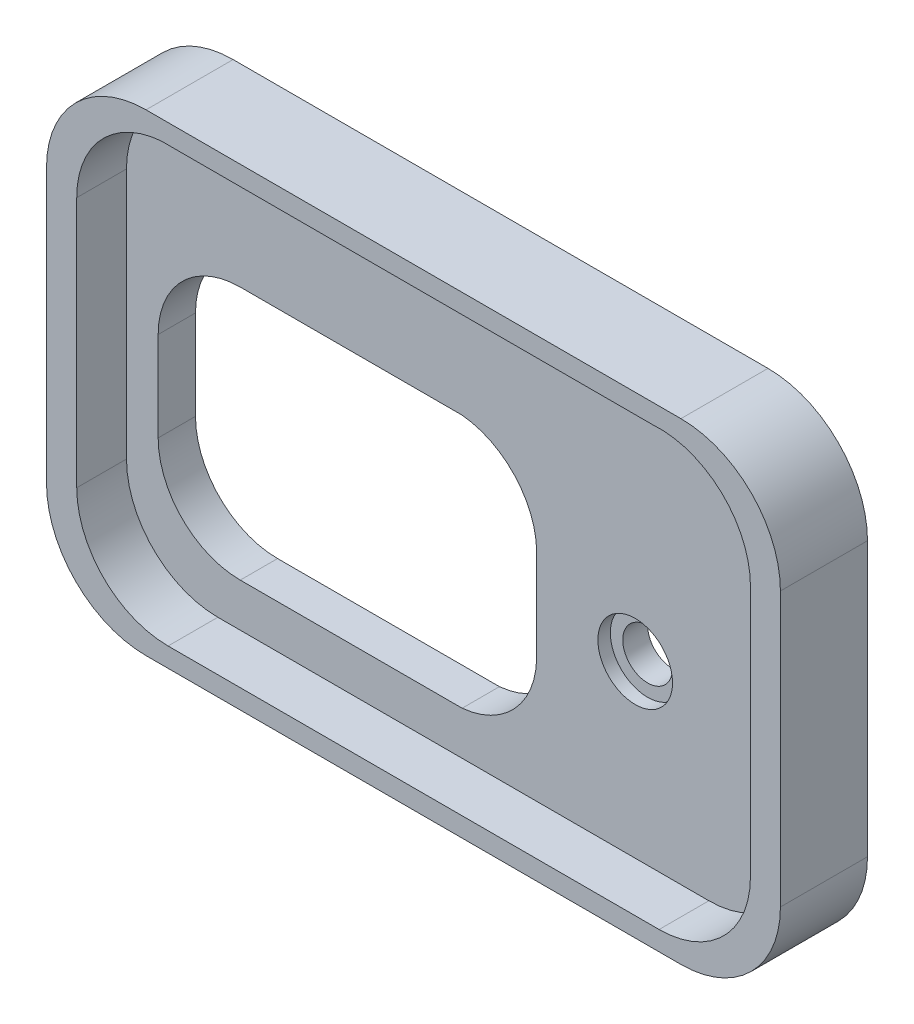
ISO-10303-21;
HEADER;
FILE_DESCRIPTION(('STEP AP214'),'2;1');
FILE_NAME('part.step','',(''),(''),'','','');
FILE_SCHEMA(('AUTOMOTIVE_DESIGN { 1 0 10303 214 1 1 1 1 }'));
ENDSEC;
DATA;
#1=APPLICATION_CONTEXT('core data for automotive mechanical design processes');
#2=APPLICATION_PROTOCOL_DEFINITION('international standard','automotive_design',2000,#1);
#3=PRODUCT_CONTEXT('',#1,'mechanical');
#4=PRODUCT('Part','Part','',(#3));
#5=PRODUCT_RELATED_PRODUCT_CATEGORY('part','',(#4));
#6=PRODUCT_DEFINITION_FORMATION('','',#4);
#7=PRODUCT_DEFINITION_CONTEXT('part definition',#1,'design');
#8=PRODUCT_DEFINITION('design','',#6,#7);
#9=PRODUCT_DEFINITION_SHAPE('','',#8);
#10=(LENGTH_UNIT() NAMED_UNIT(*) SI_UNIT(.MILLI.,.METRE.));
#11=(NAMED_UNIT(*) PLANE_ANGLE_UNIT() SI_UNIT($,.RADIAN.));
#12=(NAMED_UNIT(*) SI_UNIT($,.STERADIAN.) SOLID_ANGLE_UNIT());
#13=UNCERTAINTY_MEASURE_WITH_UNIT(LENGTH_MEASURE(1.E-05),#10,'distance_accuracy_value','');
#14=(GEOMETRIC_REPRESENTATION_CONTEXT(3) GLOBAL_UNCERTAINTY_ASSIGNED_CONTEXT((#13)) GLOBAL_UNIT_ASSIGNED_CONTEXT((#10,
#11,#12)) REPRESENTATION_CONTEXT('',''));
#15=CARTESIAN_POINT('',(0.,0.,0.));
#16=DIRECTION('',(0.,0.,1.));
#17=DIRECTION('',(1.,0.,0.));
#18=AXIS2_PLACEMENT_3D('',#15,#16,#17);
#19=CARTESIAN_POINT('',(27.511650568665,9.68988988046832,-0.635000000000001));
#20=DIRECTION('',(0.,0.,1.));
#21=DIRECTION('',(1.,0.,0.));
#22=AXIS2_PLACEMENT_3D('',#19,#20,#21);
#23=CYLINDRICAL_SURFACE('',#22,1.27);
#24=CARTESIAN_POINT('',(27.511650568665,9.68988988046832,0.));
#25=DIRECTION('',(0.,0.,-1.));
#26=DIRECTION('',(-1.,0.,0.));
#27=AXIS2_PLACEMENT_3D('',#24,#25,#26);
#28=CIRCLE('',#27,1.27);
#29=CARTESIAN_POINT('',(26.241650568665,9.68988988046832,0.));
#30=VERTEX_POINT('',#29);
#31=EDGE_CURVE('E261',#30,#30,#28,.T.);
#32=ORIENTED_EDGE('',*,*,#31,.T.);
#33=EDGE_LOOP('',(#32));
#34=FACE_BOUND('',#33,.T.);
#35=CARTESIAN_POINT('',(27.511650568665,9.68988988046832,1.27));
#36=DIRECTION('',(0.,0.,1.));
#37=DIRECTION('',(1.,0.,0.));
#38=AXIS2_PLACEMENT_3D('',#35,#36,#37);
#39=CIRCLE('',#38,1.27);
#40=CARTESIAN_POINT('',(28.781650568665,9.68988988046832,1.27));
#41=VERTEX_POINT('',#40);
#42=EDGE_CURVE('E254',#41,#41,#39,.T.);
#43=ORIENTED_EDGE('',*,*,#42,.T.);
#44=EDGE_LOOP('',(#43));
#45=FACE_BOUND('',#44,.T.);
#46=ADVANCED_FACE('F38',(#34,#45),#23,.F.);
#47=CARTESIAN_POINT('',(0.,0.,4.445));
#48=DIRECTION('',(1.,0.,0.));
#49=DIRECTION('',(0.,0.,-1.));
#50=AXIS2_PLACEMENT_3D('',#47,#48,#49);
#51=PLANE('',#50);
#52=DIRECTION('',(0.,-1.,0.));
#53=VECTOR('',#52,1.);
#54=CARTESIAN_POINT('',(0.,0.,0.));
#55=LINE('',#54,#53);
#56=CARTESIAN_POINT('',(0.,19.05,0.));
#57=VERTEX_POINT('',#56);
#58=CARTESIAN_POINT('',(0.,5.08,0.));
#59=VERTEX_POINT('',#58);
#60=EDGE_CURVE('E291',#57,#59,#55,.T.);
#61=ORIENTED_EDGE('',*,*,#60,.T.);
#62=DIRECTION('',(0.,0.,-1.));
#63=VECTOR('',#62,1.);
#64=CARTESIAN_POINT('',(0.,5.08,4.445));
#65=LINE('',#64,#63);
#66=CARTESIAN_POINT('',(0.,5.08,4.445));
#67=VERTEX_POINT('',#66);
#68=EDGE_CURVE('E362',#59,#67,#65,.F.);
#69=ORIENTED_EDGE('',*,*,#68,.T.);
#70=DIRECTION('',(0.,-1.,0.));
#71=VECTOR('',#70,1.);
#72=CARTESIAN_POINT('',(0.,0.,4.445));
#73=LINE('',#72,#71);
#74=CARTESIAN_POINT('',(0.,19.05,4.445));
#75=VERTEX_POINT('',#74);
#76=EDGE_CURVE('E305',#75,#67,#73,.T.);
#77=ORIENTED_EDGE('',*,*,#76,.F.);
#78=DIRECTION('',(0.,0.,-1.));
#79=VECTOR('',#78,1.);
#80=CARTESIAN_POINT('',(0.,19.05,4.445));
#81=LINE('',#80,#79);
#82=EDGE_CURVE('E359',#75,#57,#81,.T.);
#83=ORIENTED_EDGE('',*,*,#82,.T.);
#84=EDGE_LOOP('',(#61,#69,#77,#83));
#85=FACE_BOUND('',#84,.T.);
#86=ADVANCED_FACE('F428',(#85),#51,.F.);
#87=CARTESIAN_POINT('',(0.,0.,4.445));
#88=DIRECTION('',(0.,1.,0.));
#89=DIRECTION('',(0.,0.,1.));
#90=AXIS2_PLACEMENT_3D('',#87,#88,#89);
#91=PLANE('',#90);
#92=DIRECTION('',(1.,0.,0.));
#93=VECTOR('',#92,1.);
#94=CARTESIAN_POINT('',(0.,0.,0.));
#95=LINE('',#94,#93);
#96=CARTESIAN_POINT('',(5.08,0.,0.));
#97=VERTEX_POINT('',#96);
#98=CARTESIAN_POINT('',(32.385,0.,0.));
#99=VERTEX_POINT('',#98);
#100=EDGE_CURVE('E321',#97,#99,#95,.T.);
#101=ORIENTED_EDGE('',*,*,#100,.T.);
#102=DIRECTION('',(0.,0.,-1.));
#103=VECTOR('',#102,1.);
#104=CARTESIAN_POINT('',(32.385,0.,4.445));
#105=LINE('',#104,#103);
#106=CARTESIAN_POINT('',(32.385,0.,4.445));
#107=VERTEX_POINT('',#106);
#108=EDGE_CURVE('E357',#99,#107,#105,.F.);
#109=ORIENTED_EDGE('',*,*,#108,.T.);
#110=DIRECTION('',(1.,0.,0.));
#111=VECTOR('',#110,1.);
#112=CARTESIAN_POINT('',(0.,0.,4.445));
#113=LINE('',#112,#111);
#114=CARTESIAN_POINT('',(5.08,0.,4.445));
#115=VERTEX_POINT('',#114);
#116=EDGE_CURVE('E308',#115,#107,#113,.T.);
#117=ORIENTED_EDGE('',*,*,#116,.F.);
#118=DIRECTION('',(0.,0.,-1.));
#119=VECTOR('',#118,1.);
#120=CARTESIAN_POINT('',(5.08,0.,4.445));
#121=LINE('',#120,#119);
#122=EDGE_CURVE('E354',#115,#97,#121,.T.);
#123=ORIENTED_EDGE('',*,*,#122,.T.);
#124=EDGE_LOOP('',(#101,#109,#117,#123));
#125=FACE_BOUND('',#124,.T.);
#126=ADVANCED_FACE('F434',(#125),#91,.F.);
#127=CARTESIAN_POINT('',(37.465,0.,4.445));
#128=DIRECTION('',(-1.,0.,0.));
#129=DIRECTION('',(0.,0.,1.));
#130=AXIS2_PLACEMENT_3D('',#127,#128,#129);
#131=PLANE('',#130);
#132=DIRECTION('',(0.,1.,0.));
#133=VECTOR('',#132,1.);
#134=CARTESIAN_POINT('',(37.465,0.,0.));
#135=LINE('',#134,#133);
#136=CARTESIAN_POINT('',(37.465,5.08,0.));
#137=VERTEX_POINT('',#136);
#138=CARTESIAN_POINT('',(37.465,19.05,0.));
#139=VERTEX_POINT('',#138);
#140=EDGE_CURVE('E324',#137,#139,#135,.T.);
#141=ORIENTED_EDGE('',*,*,#140,.T.);
#142=DIRECTION('',(0.,0.,-1.));
#143=VECTOR('',#142,1.);
#144=CARTESIAN_POINT('',(37.465,19.05,4.445));
#145=LINE('',#144,#143);
#146=CARTESIAN_POINT('',(37.465,19.05,4.445));
#147=VERTEX_POINT('',#146);
#148=EDGE_CURVE('E344',#139,#147,#145,.F.);
#149=ORIENTED_EDGE('',*,*,#148,.T.);
#150=DIRECTION('',(0.,1.,0.));
#151=VECTOR('',#150,1.);
#152=CARTESIAN_POINT('',(37.465,0.,4.445));
#153=LINE('',#152,#151);
#154=CARTESIAN_POINT('',(37.465,5.08,4.445));
#155=VERTEX_POINT('',#154);
#156=EDGE_CURVE('E312',#155,#147,#153,.T.);
#157=ORIENTED_EDGE('',*,*,#156,.F.);
#158=DIRECTION('',(0.,0.,-1.));
#159=VECTOR('',#158,1.);
#160=CARTESIAN_POINT('',(37.465,5.08,4.445));
#161=LINE('',#160,#159);
#162=EDGE_CURVE('E341',#155,#137,#161,.T.);
#163=ORIENTED_EDGE('',*,*,#162,.T.);
#164=EDGE_LOOP('',(#141,#149,#157,#163));
#165=FACE_BOUND('',#164,.T.);
#166=ADVANCED_FACE('F700',(#165),#131,.F.);
#167=CARTESIAN_POINT('',(0.,24.13,4.445));
#168=DIRECTION('',(0.,-1.,0.));
#169=DIRECTION('',(0.,0.,-1.));
#170=AXIS2_PLACEMENT_3D('',#167,#168,#169);
#171=PLANE('',#170);
#172=DIRECTION('',(-1.,0.,0.));
#173=VECTOR('',#172,1.);
#174=CARTESIAN_POINT('',(0.,24.13,4.445));
#175=LINE('',#174,#173);
#176=CARTESIAN_POINT('',(32.385,24.13,4.445));
#177=VERTEX_POINT('',#176);
#178=CARTESIAN_POINT('',(5.08,24.13,4.445));
#179=VERTEX_POINT('',#178);
#180=EDGE_CURVE('E315',#177,#179,#175,.T.);
#181=ORIENTED_EDGE('',*,*,#180,.F.);
#182=DIRECTION('',(0.,0.,-1.));
#183=VECTOR('',#182,1.);
#184=CARTESIAN_POINT('',(32.385,24.13,4.445));
#185=LINE('',#184,#183);
#186=CARTESIAN_POINT('',(32.385,24.13,0.));
#187=VERTEX_POINT('',#186);
#188=EDGE_CURVE('E330',#177,#187,#185,.T.);
#189=ORIENTED_EDGE('',*,*,#188,.T.);
#190=DIRECTION('',(-1.,0.,0.));
#191=VECTOR('',#190,1.);
#192=CARTESIAN_POINT('',(0.,24.13,0.));
#193=LINE('',#192,#191);
#194=CARTESIAN_POINT('',(5.08,24.13,0.));
#195=VERTEX_POINT('',#194);
#196=EDGE_CURVE('E309',#187,#195,#193,.T.);
#197=ORIENTED_EDGE('',*,*,#196,.T.);
#198=DIRECTION('',(0.,0.,-1.));
#199=VECTOR('',#198,1.);
#200=CARTESIAN_POINT('',(5.08,24.13,4.445));
#201=LINE('',#200,#199);
#202=EDGE_CURVE('E318',#195,#179,#201,.F.);
#203=ORIENTED_EDGE('',*,*,#202,.T.);
#204=EDGE_LOOP('',(#181,#189,#197,#203));
#205=FACE_BOUND('',#204,.T.);
#206=ADVANCED_FACE('F509',(#205),#171,.F.);
#207=CARTESIAN_POINT('',(0.,0.,4.445));
#208=DIRECTION('',(0.,0.,-1.));
#209=DIRECTION('',(-1.,0.,0.));
#210=AXIS2_PLACEMENT_3D('',#207,#208,#209);
#211=PLANE('',#210);
#212=CARTESIAN_POINT('',(31.2722595725624,5.65277000000001,4.445));
#213=DIRECTION('',(0.,0.,1.));
#214=DIRECTION('',(1.,0.,0.));
#215=AXIS2_PLACEMENT_3D('',#212,#213,#214);
#216=CIRCLE('',#215,4.66344);
#217=CARTESIAN_POINT('',(31.2722595725624,0.989330000000008,4.445));
#218=VERTEX_POINT('',#217);
#219=CARTESIAN_POINT('',(35.9356995725624,5.65277000000001,4.445));
#220=VERTEX_POINT('',#219);
#221=EDGE_CURVE('E223',#218,#220,#216,.T.);
#222=ORIENTED_EDGE('',*,*,#221,.F.);
#223=DIRECTION('',(1.,0.,0.));
#224=VECTOR('',#223,1.);
#225=CARTESIAN_POINT('',(6.20626957256244,0.989330000000004,4.445));
#226=LINE('',#225,#224);
#227=CARTESIAN_POINT('',(6.20626957256244,0.989330000000004,4.445));
#228=VERTEX_POINT('',#227);
#229=EDGE_CURVE('E205',#228,#218,#226,.T.);
#230=ORIENTED_EDGE('',*,*,#229,.F.);
#231=CARTESIAN_POINT('',(6.20626957256244,5.65277000000001,4.445));
#232=DIRECTION('',(0.,0.,1.));
#233=DIRECTION('',(1.,0.,0.));
#234=AXIS2_PLACEMENT_3D('',#231,#232,#233);
#235=CIRCLE('',#234,4.66344);
#236=CARTESIAN_POINT('',(1.54282957256243,5.65277000000001,4.445));
#237=VERTEX_POINT('',#236);
#238=EDGE_CURVE('E214',#237,#228,#235,.T.);
#239=ORIENTED_EDGE('',*,*,#238,.F.);
#240=DIRECTION('',(0.,-1.,0.));
#241=VECTOR('',#240,1.);
#242=CARTESIAN_POINT('',(1.54282957256243,18.47723,4.445));
#243=LINE('',#242,#241);
#244=CARTESIAN_POINT('',(1.54282957256243,18.47723,4.445));
#245=VERTEX_POINT('',#244);
#246=EDGE_CURVE('E53',#245,#237,#243,.T.);
#247=ORIENTED_EDGE('',*,*,#246,.F.);
#248=CARTESIAN_POINT('',(6.20625206859993,18.4900072082819,4.445));
#249=DIRECTION('',(0.,0.,1.));
#250=DIRECTION('',(1.,0.,0.));
#251=AXIS2_PLACEMENT_3D('',#248,#249,#250);
#252=CIRCLE('',#251,4.66344);
#253=CARTESIAN_POINT('',(5.86127637187822,23.14067,4.445));
#254=VERTEX_POINT('',#253);
#255=EDGE_CURVE('E237',#254,#245,#252,.T.);
#256=ORIENTED_EDGE('',*,*,#255,.F.);
#257=DIRECTION('',(-1.,0.,0.));
#258=VECTOR('',#257,1.);
#259=CARTESIAN_POINT('',(30.9272663718782,23.14067,4.445));
#260=LINE('',#259,#258);
#261=CARTESIAN_POINT('',(30.9272663718782,23.14067,4.445));
#262=VERTEX_POINT('',#261);
#263=EDGE_CURVE('E234',#262,#254,#260,.T.);
#264=ORIENTED_EDGE('',*,*,#263,.F.);
#265=CARTESIAN_POINT('',(31.2722770836424,18.4900098057515,4.445));
#266=DIRECTION('',(0.,0.,1.));
#267=DIRECTION('',(1.,0.,0.));
#268=AXIS2_PLACEMENT_3D('',#265,#266,#267);
#269=CIRCLE('',#268,4.66344000000001);
#270=CARTESIAN_POINT('',(35.9356995725624,18.47723,4.445));
#271=VERTEX_POINT('',#270);
#272=EDGE_CURVE('E231',#271,#262,#269,.T.);
#273=ORIENTED_EDGE('',*,*,#272,.F.);
#274=DIRECTION('',(0.,1.,0.));
#275=VECTOR('',#274,1.);
#276=CARTESIAN_POINT('',(35.9356995725624,5.65277000000001,4.445));
#277=LINE('',#276,#275);
#278=EDGE_CURVE('E225',#220,#271,#277,.T.);
#279=ORIENTED_EDGE('',*,*,#278,.F.);
#280=EDGE_LOOP('',(#222,#230,#239,#247,#256,#264,#273,#279));
#281=FACE_BOUND('',#280,.T.);
#282=ORIENTED_EDGE('',*,*,#156,.T.);
#283=CARTESIAN_POINT('',(32.385,19.05,4.445));
#284=DIRECTION('',(0.,0.,-1.));
#285=DIRECTION('',(-1.,0.,0.));
#286=AXIS2_PLACEMENT_3D('',#283,#284,#285);
#287=CIRCLE('',#286,5.08);
#288=EDGE_CURVE('E352',#147,#177,#287,.F.);
#289=ORIENTED_EDGE('',*,*,#288,.T.);
#290=ORIENTED_EDGE('',*,*,#180,.T.);
#291=CARTESIAN_POINT('',(5.08,19.05,4.445));
#292=DIRECTION('',(0.,0.,-1.));
#293=DIRECTION('',(-1.,0.,0.));
#294=AXIS2_PLACEMENT_3D('',#291,#292,#293);
#295=CIRCLE('',#294,5.08);
#296=EDGE_CURVE('E346',#179,#75,#295,.F.);
#297=ORIENTED_EDGE('',*,*,#296,.T.);
#298=ORIENTED_EDGE('',*,*,#76,.T.);
#299=CARTESIAN_POINT('',(5.08,5.08,4.445));
#300=DIRECTION('',(0.,0.,-1.));
#301=DIRECTION('',(-1.,0.,0.));
#302=AXIS2_PLACEMENT_3D('',#299,#300,#301);
#303=CIRCLE('',#302,5.08);
#304=EDGE_CURVE('E348',#67,#115,#303,.F.);
#305=ORIENTED_EDGE('',*,*,#304,.T.);
#306=ORIENTED_EDGE('',*,*,#116,.T.);
#307=CARTESIAN_POINT('',(32.385,5.08,4.445));
#308=DIRECTION('',(0.,0.,-1.));
#309=DIRECTION('',(-1.,0.,0.));
#310=AXIS2_PLACEMENT_3D('',#307,#308,#309);
#311=CIRCLE('',#310,5.08);
#312=EDGE_CURVE('E350',#107,#155,#311,.F.);
#313=ORIENTED_EDGE('',*,*,#312,.T.);
#314=EDGE_LOOP('',(#282,#289,#290,#297,#298,#305,#306,#313));
#315=FACE_BOUND('',#314,.T.);
#316=ADVANCED_FACE('F219',(#281,#315),#211,.F.);
#317=CARTESIAN_POINT('',(0.,0.,0.));
#318=DIRECTION('',(0.,0.,-1.));
#319=DIRECTION('',(-1.,0.,0.));
#320=AXIS2_PLACEMENT_3D('',#317,#318,#319);
#321=PLANE('',#320);
#322=ORIENTED_EDGE('',*,*,#31,.F.);
#323=EDGE_LOOP('',(#322));
#324=FACE_BOUND('',#323,.T.);
#325=CARTESIAN_POINT('',(7.35086965438628,11.9679737585275,0.));
#326=DIRECTION('',(0.,0.,-1.));
#327=DIRECTION('',(-1.,0.,0.));
#328=AXIS2_PLACEMENT_3D('',#325,#326,#327);
#329=CIRCLE('',#328,4.19100000000001);
#330=CARTESIAN_POINT('',(3.15986965438626,11.9679737585274,0.));
#331=VERTEX_POINT('',#330);
#332=CARTESIAN_POINT('',(7.35086965438628,16.1589737585275,0.));
#333=VERTEX_POINT('',#332);
#334=EDGE_CURVE('E11',#331,#333,#329,.T.);
#335=ORIENTED_EDGE('',*,*,#334,.F.);
#336=DIRECTION('',(0.,1.,0.));
#337=VECTOR('',#336,1.);
#338=CARTESIAN_POINT('',(3.15986965438626,0.,0.));
#339=LINE('',#338,#337);
#340=CARTESIAN_POINT('',(3.15986965438626,7.39597375852747,0.));
#341=VERTEX_POINT('',#340);
#342=EDGE_CURVE('E364',#341,#331,#339,.T.);
#343=ORIENTED_EDGE('',*,*,#342,.F.);
#344=CARTESIAN_POINT('',(7.35086965438626,7.39597375852747,0.));
#345=DIRECTION('',(0.,0.,-1.));
#346=DIRECTION('',(-1.,0.,0.));
#347=AXIS2_PLACEMENT_3D('',#344,#345,#346);
#348=CIRCLE('',#347,4.191);
#349=CARTESIAN_POINT('',(7.35086965438665,3.20497375852747,0.));
#350=VERTEX_POINT('',#349);
#351=EDGE_CURVE('E366',#350,#341,#348,.T.);
#352=ORIENTED_EDGE('',*,*,#351,.F.);
#353=DIRECTION('',(-1.,0.,0.));
#354=VECTOR('',#353,1.);
#355=CARTESIAN_POINT('',(0.,3.20497375852747,0.));
#356=LINE('',#355,#354);
#357=CARTESIAN_POINT('',(18.6779953133419,3.20497375852747,0.));
#358=VERTEX_POINT('',#357);
#359=EDGE_CURVE('E369',#358,#350,#356,.T.);
#360=ORIENTED_EDGE('',*,*,#359,.F.);
#361=CARTESIAN_POINT('',(18.2728696543863,7.39597375852747,0.));
#362=DIRECTION('',(0.,0.,-1.));
#363=DIRECTION('',(-1.,0.,0.));
#364=AXIS2_PLACEMENT_3D('',#361,#362,#363);
#365=CIRCLE('',#364,4.21053533408095);
#366=CARTESIAN_POINT('',(22.4638696543863,7.80109941748326,0.));
#367=VERTEX_POINT('',#366);
#368=EDGE_CURVE('E371',#367,#358,#365,.T.);
#369=ORIENTED_EDGE('',*,*,#368,.F.);
#370=DIRECTION('',(0.,1.,0.));
#371=VECTOR('',#370,1.);
#372=CARTESIAN_POINT('',(22.4638696543863,0.,0.));
#373=LINE('',#372,#371);
#374=CARTESIAN_POINT('',(22.4638696543863,11.5628480995716,0.));
#375=VERTEX_POINT('',#374);
#376=EDGE_CURVE('E373',#367,#375,#373,.T.);
#377=ORIENTED_EDGE('',*,*,#376,.T.);
#378=CARTESIAN_POINT('',(18.2728696543863,11.9679737585275,0.));
#379=DIRECTION('',(0.,0.,-1.));
#380=DIRECTION('',(-1.,0.,0.));
#381=AXIS2_PLACEMENT_3D('',#378,#379,#380);
#382=CIRCLE('',#381,4.21053533408098);
#383=CARTESIAN_POINT('',(18.6779953133422,16.1589737585275,0.));
#384=VERTEX_POINT('',#383);
#385=EDGE_CURVE('E376',#375,#384,#382,.F.);
#386=ORIENTED_EDGE('',*,*,#385,.T.);
#387=DIRECTION('',(-1.,0.,0.));
#388=VECTOR('',#387,1.);
#389=CARTESIAN_POINT('',(0.,16.1589737585275,0.));
#390=LINE('',#389,#388);
#391=EDGE_CURVE('E46',#384,#333,#390,.T.);
#392=ORIENTED_EDGE('',*,*,#391,.T.);
#393=EDGE_LOOP('',(#335,#343,#352,#360,#369,#377,#386,#392));
#394=FACE_BOUND('',#393,.T.);
#395=ORIENTED_EDGE('',*,*,#196,.F.);
#396=CARTESIAN_POINT('',(32.385,19.05,0.));
#397=DIRECTION('',(0.,0.,-1.));
#398=DIRECTION('',(-1.,0.,0.));
#399=AXIS2_PLACEMENT_3D('',#396,#397,#398);
#400=CIRCLE('',#399,5.08);
#401=EDGE_CURVE('E339',#187,#139,#400,.T.);
#402=ORIENTED_EDGE('',*,*,#401,.T.);
#403=ORIENTED_EDGE('',*,*,#140,.F.);
#404=CARTESIAN_POINT('',(32.385,5.08,0.));
#405=DIRECTION('',(0.,0.,-1.));
#406=DIRECTION('',(-1.,0.,0.));
#407=AXIS2_PLACEMENT_3D('',#404,#405,#406);
#408=CIRCLE('',#407,5.08);
#409=EDGE_CURVE('E337',#137,#99,#408,.T.);
#410=ORIENTED_EDGE('',*,*,#409,.T.);
#411=ORIENTED_EDGE('',*,*,#100,.F.);
#412=CARTESIAN_POINT('',(5.08,5.08,0.));
#413=DIRECTION('',(0.,0.,-1.));
#414=DIRECTION('',(-1.,0.,0.));
#415=AXIS2_PLACEMENT_3D('',#412,#413,#414);
#416=CIRCLE('',#415,5.08);
#417=EDGE_CURVE('E335',#97,#59,#416,.T.);
#418=ORIENTED_EDGE('',*,*,#417,.T.);
#419=ORIENTED_EDGE('',*,*,#60,.F.);
#420=CARTESIAN_POINT('',(5.08,19.05,0.));
#421=DIRECTION('',(0.,0.,-1.));
#422=DIRECTION('',(-1.,0.,0.));
#423=AXIS2_PLACEMENT_3D('',#420,#421,#422);
#424=CIRCLE('',#423,5.08);
#425=EDGE_CURVE('E333',#57,#195,#424,.T.);
#426=ORIENTED_EDGE('',*,*,#425,.T.);
#427=EDGE_LOOP('',(#395,#402,#403,#410,#411,#418,#419,#426));
#428=FACE_BOUND('',#427,.T.);
#429=ADVANCED_FACE('F381',(#324,#394,#428),#321,.T.);
#430=CARTESIAN_POINT('',(0.,0.,1.905));
#431=DIRECTION('',(0.,0.,1.));
#432=DIRECTION('',(1.,0.,0.));
#433=AXIS2_PLACEMENT_3D('',#430,#431,#432);
#434=PLANE('',#433);
#435=CARTESIAN_POINT('',(27.511650568665,9.68988988046832,1.905));
#436=DIRECTION('',(0.,0.,1.));
#437=DIRECTION('',(1.,0.,0.));
#438=AXIS2_PLACEMENT_3D('',#435,#436,#437);
#439=CIRCLE('',#438,1.905);
#440=CARTESIAN_POINT('',(29.416650568665,9.68988988046832,1.905));
#441=VERTEX_POINT('',#440);
#442=EDGE_CURVE('E257',#441,#441,#439,.T.);
#443=ORIENTED_EDGE('',*,*,#442,.F.);
#444=EDGE_LOOP('',(#443));
#445=FACE_BOUND('',#444,.T.);
#446=CARTESIAN_POINT('',(7.35086965438628,11.9679737585275,1.905));
#447=DIRECTION('',(0.,0.,1.));
#448=DIRECTION('',(1.,0.,0.));
#449=AXIS2_PLACEMENT_3D('',#446,#447,#448);
#450=CIRCLE('',#449,4.19100000000001);
#451=CARTESIAN_POINT('',(7.35086965438628,16.1589737585275,1.905));
#452=VERTEX_POINT('',#451);
#453=CARTESIAN_POINT('',(3.15986965438626,11.9679737585274,1.905));
#454=VERTEX_POINT('',#453);
#455=EDGE_CURVE('E266',#452,#454,#450,.T.);
#456=ORIENTED_EDGE('',*,*,#455,.F.);
#457=DIRECTION('',(1.,0.,0.));
#458=VECTOR('',#457,1.);
#459=CARTESIAN_POINT('',(7.35086965438628,16.1589737585275,1.905));
#460=LINE('',#459,#458);
#461=CARTESIAN_POINT('',(18.6779953133422,16.1589737585275,1.905));
#462=VERTEX_POINT('',#461);
#463=EDGE_CURVE('E285',#452,#462,#460,.T.);
#464=ORIENTED_EDGE('',*,*,#463,.T.);
#465=CARTESIAN_POINT('',(18.2728696543863,11.9679737585275,1.905));
#466=DIRECTION('',(0.,0.,-1.));
#467=DIRECTION('',(-1.,0.,0.));
#468=AXIS2_PLACEMENT_3D('',#465,#466,#467);
#469=CIRCLE('',#468,4.21053533408098);
#470=CARTESIAN_POINT('',(22.4638696543863,11.5628480995716,1.905));
#471=VERTEX_POINT('',#470);
#472=EDGE_CURVE('E61',#462,#471,#469,.T.);
#473=ORIENTED_EDGE('',*,*,#472,.T.);
#474=DIRECTION('',(0.,-1.,0.));
#475=VECTOR('',#474,1.);
#476=CARTESIAN_POINT('',(22.4638696543863,11.5628480995716,1.905));
#477=LINE('',#476,#475);
#478=CARTESIAN_POINT('',(22.4638696543863,7.80109941748326,1.905));
#479=VERTEX_POINT('',#478);
#480=EDGE_CURVE('E281',#471,#479,#477,.T.);
#481=ORIENTED_EDGE('',*,*,#480,.T.);
#482=CARTESIAN_POINT('',(18.2728696543863,7.39597375852747,1.905));
#483=DIRECTION('',(0.,0.,1.));
#484=DIRECTION('',(1.,0.,0.));
#485=AXIS2_PLACEMENT_3D('',#482,#483,#484);
#486=CIRCLE('',#485,4.21053533408095);
#487=CARTESIAN_POINT('',(18.6779953133419,3.20497375852747,1.905));
#488=VERTEX_POINT('',#487);
#489=EDGE_CURVE('E278',#488,#479,#486,.T.);
#490=ORIENTED_EDGE('',*,*,#489,.F.);
#491=DIRECTION('',(1.,0.,0.));
#492=VECTOR('',#491,1.);
#493=CARTESIAN_POINT('',(7.35086965438665,3.20497375852747,1.905));
#494=LINE('',#493,#492);
#495=CARTESIAN_POINT('',(7.35086965438665,3.20497375852747,1.905));
#496=VERTEX_POINT('',#495);
#497=EDGE_CURVE('E275',#496,#488,#494,.T.);
#498=ORIENTED_EDGE('',*,*,#497,.F.);
#499=CARTESIAN_POINT('',(7.35086965438626,7.39597375852747,1.905));
#500=DIRECTION('',(0.,0.,1.));
#501=DIRECTION('',(1.,0.,0.));
#502=AXIS2_PLACEMENT_3D('',#499,#500,#501);
#503=CIRCLE('',#502,4.191);
#504=CARTESIAN_POINT('',(3.15986965438626,7.39597375852747,1.905));
#505=VERTEX_POINT('',#504);
#506=EDGE_CURVE('E272',#505,#496,#503,.T.);
#507=ORIENTED_EDGE('',*,*,#506,.F.);
#508=DIRECTION('',(0.,-1.,0.));
#509=VECTOR('',#508,1.);
#510=CARTESIAN_POINT('',(3.15986965438626,11.9679737585274,1.905));
#511=LINE('',#510,#509);
#512=EDGE_CURVE('E269',#454,#505,#511,.T.);
#513=ORIENTED_EDGE('',*,*,#512,.F.);
#514=EDGE_LOOP('',(#456,#464,#473,#481,#490,#498,#507,#513));
#515=FACE_BOUND('',#514,.T.);
#516=CARTESIAN_POINT('',(6.20626957256244,5.65277000000001,1.905));
#517=DIRECTION('',(0.,0.,1.));
#518=DIRECTION('',(1.,0.,0.));
#519=AXIS2_PLACEMENT_3D('',#516,#517,#518);
#520=CIRCLE('',#519,4.66344);
#521=CARTESIAN_POINT('',(6.20626957256244,0.989330000000004,1.905));
#522=VERTEX_POINT('',#521);
#523=CARTESIAN_POINT('',(1.54282957256244,5.65277,1.905));
#524=VERTEX_POINT('',#523);
#525=EDGE_CURVE('E603',#522,#524,#520,.F.);
#526=ORIENTED_EDGE('',*,*,#525,.F.);
#527=DIRECTION('',(-1.,0.,0.));
#528=VECTOR('',#527,1.);
#529=CARTESIAN_POINT('',(6.20626957256244,0.989330000000004,1.905));
#530=LINE('',#529,#528);
#531=CARTESIAN_POINT('',(31.2722595725624,0.989330000000008,1.905));
#532=VERTEX_POINT('',#531);
#533=EDGE_CURVE('E208',#532,#522,#530,.T.);
#534=ORIENTED_EDGE('',*,*,#533,.F.);
#535=CARTESIAN_POINT('',(31.2722595725624,5.65277000000001,1.905));
#536=DIRECTION('',(0.,0.,1.));
#537=DIRECTION('',(1.,0.,0.));
#538=AXIS2_PLACEMENT_3D('',#535,#536,#537);
#539=CIRCLE('',#538,4.66344);
#540=CARTESIAN_POINT('',(35.9356995725624,5.65277000000001,1.905));
#541=VERTEX_POINT('',#540);
#542=EDGE_CURVE('E242',#541,#532,#539,.F.);
#543=ORIENTED_EDGE('',*,*,#542,.F.);
#544=DIRECTION('',(0.,-1.,0.));
#545=VECTOR('',#544,1.);
#546=CARTESIAN_POINT('',(35.9356995725624,5.65277000000001,1.905));
#547=LINE('',#546,#545);
#548=CARTESIAN_POINT('',(35.9356995725624,18.47723,1.905));
#549=VERTEX_POINT('',#548);
#550=EDGE_CURVE('E619',#549,#541,#547,.T.);
#551=ORIENTED_EDGE('',*,*,#550,.F.);
#552=CARTESIAN_POINT('',(31.2722770836424,18.4900098057515,1.905));
#553=DIRECTION('',(0.,0.,1.));
#554=DIRECTION('',(1.,0.,0.));
#555=AXIS2_PLACEMENT_3D('',#552,#553,#554);
#556=CIRCLE('',#555,4.66344000000001);
#557=CARTESIAN_POINT('',(30.9272663718782,23.14067,1.905));
#558=VERTEX_POINT('',#557);
#559=EDGE_CURVE('E616',#558,#549,#556,.F.);
#560=ORIENTED_EDGE('',*,*,#559,.F.);
#561=DIRECTION('',(1.,0.,0.));
#562=VECTOR('',#561,1.);
#563=CARTESIAN_POINT('',(30.9272663718782,23.14067,1.905));
#564=LINE('',#563,#562);
#565=CARTESIAN_POINT('',(5.86127637187822,23.14067,1.905));
#566=VERTEX_POINT('',#565);
#567=EDGE_CURVE('E608',#566,#558,#564,.T.);
#568=ORIENTED_EDGE('',*,*,#567,.F.);
#569=CARTESIAN_POINT('',(6.20625206859993,18.4900072082819,1.905));
#570=DIRECTION('',(0.,0.,1.));
#571=DIRECTION('',(1.,0.,0.));
#572=AXIS2_PLACEMENT_3D('',#569,#570,#571);
#573=CIRCLE('',#572,4.66344);
#574=CARTESIAN_POINT('',(1.54282957256243,18.47723,1.905));
#575=VERTEX_POINT('',#574);
#576=EDGE_CURVE('E604',#575,#566,#573,.F.);
#577=ORIENTED_EDGE('',*,*,#576,.F.);
#578=DIRECTION('',(0.,1.,0.));
#579=VECTOR('',#578,1.);
#580=CARTESIAN_POINT('',(1.54282957256243,18.47723,1.905));
#581=LINE('',#580,#579);
#582=EDGE_CURVE('E600',#524,#575,#581,.T.);
#583=ORIENTED_EDGE('',*,*,#582,.F.);
#584=EDGE_LOOP('',(#526,#534,#543,#551,#560,#568,#577,#583));
#585=FACE_BOUND('',#584,.T.);
#586=ADVANCED_FACE('F408',(#445,#515,#585),#434,.T.);
#587=CARTESIAN_POINT('',(32.385,19.05,4.445));
#588=DIRECTION('',(0.,0.,-1.));
#589=DIRECTION('',(-1.,0.,0.));
#590=AXIS2_PLACEMENT_3D('',#587,#588,#589);
#591=CYLINDRICAL_SURFACE('',#590,5.08);
#592=ORIENTED_EDGE('',*,*,#288,.F.);
#593=ORIENTED_EDGE('',*,*,#148,.F.);
#594=ORIENTED_EDGE('',*,*,#401,.F.);
#595=ORIENTED_EDGE('',*,*,#188,.F.);
#596=EDGE_LOOP('',(#592,#593,#594,#595));
#597=FACE_BOUND('',#596,.T.);
#598=ADVANCED_FACE('F518',(#597),#591,.T.);
#599=CARTESIAN_POINT('',(32.385,5.08,4.445));
#600=DIRECTION('',(0.,0.,-1.));
#601=DIRECTION('',(-1.,0.,0.));
#602=AXIS2_PLACEMENT_3D('',#599,#600,#601);
#603=CYLINDRICAL_SURFACE('',#602,5.08);
#604=ORIENTED_EDGE('',*,*,#312,.F.);
#605=ORIENTED_EDGE('',*,*,#108,.F.);
#606=ORIENTED_EDGE('',*,*,#409,.F.);
#607=ORIENTED_EDGE('',*,*,#162,.F.);
#608=EDGE_LOOP('',(#604,#605,#606,#607));
#609=FACE_BOUND('',#608,.T.);
#610=ADVANCED_FACE('F629',(#609),#603,.T.);
#611=CARTESIAN_POINT('',(5.08,5.08,4.445));
#612=DIRECTION('',(0.,0.,-1.));
#613=DIRECTION('',(-1.,0.,0.));
#614=AXIS2_PLACEMENT_3D('',#611,#612,#613);
#615=CYLINDRICAL_SURFACE('',#614,5.08);
#616=ORIENTED_EDGE('',*,*,#304,.F.);
#617=ORIENTED_EDGE('',*,*,#68,.F.);
#618=ORIENTED_EDGE('',*,*,#417,.F.);
#619=ORIENTED_EDGE('',*,*,#122,.F.);
#620=EDGE_LOOP('',(#616,#617,#618,#619));
#621=FACE_BOUND('',#620,.T.);
#622=ADVANCED_FACE('F638',(#621),#615,.T.);
#623=CARTESIAN_POINT('',(5.08,19.05,4.445));
#624=DIRECTION('',(0.,0.,-1.));
#625=DIRECTION('',(-1.,0.,0.));
#626=AXIS2_PLACEMENT_3D('',#623,#624,#625);
#627=CYLINDRICAL_SURFACE('',#626,5.08);
#628=ORIENTED_EDGE('',*,*,#296,.F.);
#629=ORIENTED_EDGE('',*,*,#202,.F.);
#630=ORIENTED_EDGE('',*,*,#425,.F.);
#631=ORIENTED_EDGE('',*,*,#82,.F.);
#632=EDGE_LOOP('',(#628,#629,#630,#631));
#633=FACE_BOUND('',#632,.T.);
#634=ADVANCED_FACE('F40',(#633),#627,.T.);
#635=CARTESIAN_POINT('',(7.35086965438628,11.9679737585275,-0.635000000000001));
#636=DIRECTION('',(0.,0.,1.));
#637=DIRECTION('',(1.,0.,0.));
#638=AXIS2_PLACEMENT_3D('',#635,#636,#637);
#639=CYLINDRICAL_SURFACE('',#638,4.19100000000001);
#640=ORIENTED_EDGE('',*,*,#334,.T.);
#641=DIRECTION('',(0.,0.,1.));
#642=VECTOR('',#641,1.);
#643=CARTESIAN_POINT('',(7.35086965438628,16.1589737585275,-0.635000000000001));
#644=LINE('',#643,#642);
#645=EDGE_CURVE('E289',#333,#452,#644,.T.);
#646=ORIENTED_EDGE('',*,*,#645,.T.);
#647=ORIENTED_EDGE('',*,*,#455,.T.);
#648=DIRECTION('',(0.,0.,1.));
#649=VECTOR('',#648,1.);
#650=CARTESIAN_POINT('',(3.15986965438626,11.9679737585274,-0.635000000000001));
#651=LINE('',#650,#649);
#652=EDGE_CURVE('E288',#331,#454,#651,.T.);
#653=ORIENTED_EDGE('',*,*,#652,.F.);
#654=EDGE_LOOP('',(#640,#646,#647,#653));
#655=FACE_BOUND('',#654,.T.);
#656=ADVANCED_FACE('F413',(#655),#639,.F.);
#657=CARTESIAN_POINT('',(7.35086965438628,16.1589737585275,-0.635000000000001));
#658=DIRECTION('',(0.,-1.,0.));
#659=DIRECTION('',(0.,0.,-1.));
#660=AXIS2_PLACEMENT_3D('',#657,#658,#659);
#661=PLANE('',#660);
#662=DIRECTION('',(0.,0.,1.));
#663=VECTOR('',#662,1.);
#664=CARTESIAN_POINT('',(18.6779953133422,16.1589737585275,-0.635000000000001));
#665=LINE('',#664,#663);
#666=EDGE_CURVE('E292',#384,#462,#665,.T.);
#667=ORIENTED_EDGE('',*,*,#666,.T.);
#668=ORIENTED_EDGE('',*,*,#463,.F.);
#669=ORIENTED_EDGE('',*,*,#645,.F.);
#670=ORIENTED_EDGE('',*,*,#391,.F.);
#671=EDGE_LOOP('',(#667,#668,#669,#670));
#672=FACE_BOUND('',#671,.T.);
#673=ADVANCED_FACE('F386',(#672),#661,.T.);
#674=CARTESIAN_POINT('',(18.2728696543863,11.9679737585275,-0.635000000000001));
#675=DIRECTION('',(0.,0.,1.));
#676=DIRECTION('',(1.,0.,0.));
#677=AXIS2_PLACEMENT_3D('',#674,#675,#676);
#678=CYLINDRICAL_SURFACE('',#677,4.21053533408098);
#679=DIRECTION('',(0.,0.,1.));
#680=VECTOR('',#679,1.);
#681=CARTESIAN_POINT('',(22.4638696543863,11.5628480995716,-0.635000000000001));
#682=LINE('',#681,#680);
#683=EDGE_CURVE('E294',#375,#471,#682,.T.);
#684=ORIENTED_EDGE('',*,*,#683,.T.);
#685=ORIENTED_EDGE('',*,*,#472,.F.);
#686=ORIENTED_EDGE('',*,*,#666,.F.);
#687=ORIENTED_EDGE('',*,*,#385,.F.);
#688=EDGE_LOOP('',(#684,#685,#686,#687));
#689=FACE_BOUND('',#688,.T.);
#690=ADVANCED_FACE('F388',(#689),#678,.F.);
#691=CARTESIAN_POINT('',(22.4638696543863,11.5628480995716,-0.635000000000001));
#692=DIRECTION('',(-1.,0.,0.));
#693=DIRECTION('',(0.,0.,1.));
#694=AXIS2_PLACEMENT_3D('',#691,#692,#693);
#695=PLANE('',#694);
#696=DIRECTION('',(0.,0.,1.));
#697=VECTOR('',#696,1.);
#698=CARTESIAN_POINT('',(22.4638696543863,7.80109941748326,-0.635000000000001));
#699=LINE('',#698,#697);
#700=EDGE_CURVE('E296',#367,#479,#699,.T.);
#701=ORIENTED_EDGE('',*,*,#700,.T.);
#702=ORIENTED_EDGE('',*,*,#480,.F.);
#703=ORIENTED_EDGE('',*,*,#683,.F.);
#704=ORIENTED_EDGE('',*,*,#376,.F.);
#705=EDGE_LOOP('',(#701,#702,#703,#704));
#706=FACE_BOUND('',#705,.T.);
#707=ADVANCED_FACE('F392',(#706),#695,.T.);
#708=CARTESIAN_POINT('',(18.2728696543863,7.39597375852747,-0.635000000000001));
#709=DIRECTION('',(0.,0.,1.));
#710=DIRECTION('',(1.,0.,0.));
#711=AXIS2_PLACEMENT_3D('',#708,#709,#710);
#712=CYLINDRICAL_SURFACE('',#711,4.21053533408095);
#713=ORIENTED_EDGE('',*,*,#368,.T.);
#714=DIRECTION('',(0.,0.,1.));
#715=VECTOR('',#714,1.);
#716=CARTESIAN_POINT('',(18.6779953133419,3.20497375852747,-0.635000000000001));
#717=LINE('',#716,#715);
#718=EDGE_CURVE('E298',#358,#488,#717,.T.);
#719=ORIENTED_EDGE('',*,*,#718,.T.);
#720=ORIENTED_EDGE('',*,*,#489,.T.);
#721=ORIENTED_EDGE('',*,*,#700,.F.);
#722=EDGE_LOOP('',(#713,#719,#720,#721));
#723=FACE_BOUND('',#722,.T.);
#724=ADVANCED_FACE('F399',(#723),#712,.F.);
#725=CARTESIAN_POINT('',(7.35086965438665,3.20497375852747,-0.635000000000001));
#726=DIRECTION('',(0.,-1.,0.));
#727=DIRECTION('',(1.,0.,0.));
#728=AXIS2_PLACEMENT_3D('',#725,#726,#727);
#729=PLANE('',#728);
#730=ORIENTED_EDGE('',*,*,#359,.T.);
#731=DIRECTION('',(0.,0.,1.));
#732=VECTOR('',#731,1.);
#733=CARTESIAN_POINT('',(7.35086965438665,3.20497375852747,-0.635000000000001));
#734=LINE('',#733,#732);
#735=EDGE_CURVE('E300',#350,#496,#734,.T.);
#736=ORIENTED_EDGE('',*,*,#735,.T.);
#737=ORIENTED_EDGE('',*,*,#497,.T.);
#738=ORIENTED_EDGE('',*,*,#718,.F.);
#739=EDGE_LOOP('',(#730,#736,#737,#738));
#740=FACE_BOUND('',#739,.T.);
#741=ADVANCED_FACE('F401',(#740),#729,.F.);
#742=CARTESIAN_POINT('',(7.35086965438626,7.39597375852747,-0.635000000000001));
#743=DIRECTION('',(0.,0.,1.));
#744=DIRECTION('',(1.,0.,0.));
#745=AXIS2_PLACEMENT_3D('',#742,#743,#744);
#746=CYLINDRICAL_SURFACE('',#745,4.191);
#747=ORIENTED_EDGE('',*,*,#351,.T.);
#748=DIRECTION('',(0.,0.,1.));
#749=VECTOR('',#748,1.);
#750=CARTESIAN_POINT('',(3.15986965438626,7.39597375852747,-0.635000000000001));
#751=LINE('',#750,#749);
#752=EDGE_CURVE('E302',#341,#505,#751,.T.);
#753=ORIENTED_EDGE('',*,*,#752,.T.);
#754=ORIENTED_EDGE('',*,*,#506,.T.);
#755=ORIENTED_EDGE('',*,*,#735,.F.);
#756=EDGE_LOOP('',(#747,#753,#754,#755));
#757=FACE_BOUND('',#756,.T.);
#758=ADVANCED_FACE('F417',(#757),#746,.F.);
#759=CARTESIAN_POINT('',(3.15986965438626,11.9679737585274,-0.635000000000001));
#760=DIRECTION('',(-1.,0.,0.));
#761=DIRECTION('',(0.,-1.,0.));
#762=AXIS2_PLACEMENT_3D('',#759,#760,#761);
#763=PLANE('',#762);
#764=ORIENTED_EDGE('',*,*,#342,.T.);
#765=ORIENTED_EDGE('',*,*,#652,.T.);
#766=ORIENTED_EDGE('',*,*,#512,.T.);
#767=ORIENTED_EDGE('',*,*,#752,.F.);
#768=EDGE_LOOP('',(#764,#765,#766,#767));
#769=FACE_BOUND('',#768,.T.);
#770=ADVANCED_FACE('F415',(#769),#763,.F.);
#771=CARTESIAN_POINT('',(27.511650568665,9.68988988046832,1.27));
#772=DIRECTION('',(0.,0.,1.));
#773=DIRECTION('',(1.,0.,0.));
#774=AXIS2_PLACEMENT_3D('',#771,#772,#773);
#775=CYLINDRICAL_SURFACE('',#774,1.905);
#776=CARTESIAN_POINT('',(27.511650568665,9.68988988046832,1.27));
#777=DIRECTION('',(0.,0.,1.));
#778=DIRECTION('',(1.,0.,0.));
#779=AXIS2_PLACEMENT_3D('',#776,#777,#778);
#780=CIRCLE('',#779,1.905);
#781=CARTESIAN_POINT('',(29.416650568665,9.68988988046832,1.27));
#782=VERTEX_POINT('',#781);
#783=EDGE_CURVE('E258',#782,#782,#780,.T.);
#784=ORIENTED_EDGE('',*,*,#783,.F.);
#785=EDGE_LOOP('',(#784));
#786=FACE_BOUND('',#785,.T.);
#787=ORIENTED_EDGE('',*,*,#442,.T.);
#788=EDGE_LOOP('',(#787));
#789=FACE_BOUND('',#788,.T.);
#790=ADVANCED_FACE('F424',(#786,#789),#775,.F.);
#791=CARTESIAN_POINT('',(27.511650568665,9.68988988046832,1.27));
#792=DIRECTION('',(0.,0.,1.));
#793=DIRECTION('',(1.,0.,0.));
#794=AXIS2_PLACEMENT_3D('',#791,#792,#793);
#795=PLANE('',#794);
#796=ORIENTED_EDGE('',*,*,#42,.F.);
#797=EDGE_LOOP('',(#796));
#798=FACE_BOUND('',#797,.T.);
#799=ORIENTED_EDGE('',*,*,#783,.T.);
#800=EDGE_LOOP('',(#799));
#801=FACE_BOUND('',#800,.T.);
#802=ADVANCED_FACE('F492',(#798,#801),#795,.T.);
#803=CARTESIAN_POINT('',(6.20626957256244,0.989330000000004,-39.0110130283663));
#804=DIRECTION('',(0.,-1.,0.));
#805=DIRECTION('',(1.,0.,0.));
#806=AXIS2_PLACEMENT_3D('',#803,#804,#805);
#807=PLANE('',#806);
#808=ORIENTED_EDGE('',*,*,#533,.T.);
#809=DIRECTION('',(0.,0.,1.));
#810=VECTOR('',#809,1.);
#811=CARTESIAN_POINT('',(6.20626957256244,0.989330000000004,-39.0110130283663));
#812=LINE('',#811,#810);
#813=EDGE_CURVE('E200',#522,#228,#812,.T.);
#814=ORIENTED_EDGE('',*,*,#813,.T.);
#815=ORIENTED_EDGE('',*,*,#229,.T.);
#816=DIRECTION('',(0.,0.,1.));
#817=VECTOR('',#816,1.);
#818=CARTESIAN_POINT('',(31.2722595725624,0.989330000000008,-39.0110130283663));
#819=LINE('',#818,#817);
#820=EDGE_CURVE('E211',#532,#218,#819,.T.);
#821=ORIENTED_EDGE('',*,*,#820,.F.);
#822=EDGE_LOOP('',(#808,#814,#815,#821));
#823=FACE_BOUND('',#822,.T.);
#824=ADVANCED_FACE('F202',(#823),#807,.F.);
#825=CARTESIAN_POINT('',(31.2722595725624,5.65277000000001,-39.0110130283663));
#826=DIRECTION('',(0.,0.,1.));
#827=DIRECTION('',(1.,0.,0.));
#828=AXIS2_PLACEMENT_3D('',#825,#826,#827);
#829=CYLINDRICAL_SURFACE('',#828,4.66344);
#830=ORIENTED_EDGE('',*,*,#542,.T.);
#831=ORIENTED_EDGE('',*,*,#820,.T.);
#832=ORIENTED_EDGE('',*,*,#221,.T.);
#833=DIRECTION('',(0.,0.,1.));
#834=VECTOR('',#833,1.);
#835=CARTESIAN_POINT('',(35.9356995725624,5.65277000000001,-39.0110130283663));
#836=LINE('',#835,#834);
#837=EDGE_CURVE('E251',#541,#220,#836,.T.);
#838=ORIENTED_EDGE('',*,*,#837,.F.);
#839=EDGE_LOOP('',(#830,#831,#832,#838));
#840=FACE_BOUND('',#839,.T.);
#841=ADVANCED_FACE('F529',(#840),#829,.F.);
#842=CARTESIAN_POINT('',(35.9356995725624,5.65277000000001,-39.0110130283663));
#843=DIRECTION('',(1.,0.,0.));
#844=DIRECTION('',(0.,0.,-1.));
#845=AXIS2_PLACEMENT_3D('',#842,#843,#844);
#846=PLANE('',#845);
#847=ORIENTED_EDGE('',*,*,#550,.T.);
#848=ORIENTED_EDGE('',*,*,#837,.T.);
#849=ORIENTED_EDGE('',*,*,#278,.T.);
#850=DIRECTION('',(0.,0.,1.));
#851=VECTOR('',#850,1.);
#852=CARTESIAN_POINT('',(35.9356995725624,18.47723,-39.0110130283663));
#853=LINE('',#852,#851);
#854=EDGE_CURVE('E249',#549,#271,#853,.T.);
#855=ORIENTED_EDGE('',*,*,#854,.F.);
#856=EDGE_LOOP('',(#847,#848,#849,#855));
#857=FACE_BOUND('',#856,.T.);
#858=ADVANCED_FACE('F538',(#857),#846,.F.);
#859=CARTESIAN_POINT('',(31.2722770836424,18.4900098057515,-39.0110130283663));
#860=DIRECTION('',(0.,0.,1.));
#861=DIRECTION('',(1.,0.,0.));
#862=AXIS2_PLACEMENT_3D('',#859,#860,#861);
#863=CYLINDRICAL_SURFACE('',#862,4.66344000000001);
#864=ORIENTED_EDGE('',*,*,#559,.T.);
#865=ORIENTED_EDGE('',*,*,#854,.T.);
#866=ORIENTED_EDGE('',*,*,#272,.T.);
#867=DIRECTION('',(0.,0.,1.));
#868=VECTOR('',#867,1.);
#869=CARTESIAN_POINT('',(30.9272663718782,23.14067,-39.0110130283663));
#870=LINE('',#869,#868);
#871=EDGE_CURVE('E247',#558,#262,#870,.T.);
#872=ORIENTED_EDGE('',*,*,#871,.F.);
#873=EDGE_LOOP('',(#864,#865,#866,#872));
#874=FACE_BOUND('',#873,.T.);
#875=ADVANCED_FACE('F548',(#874),#863,.F.);
#876=CARTESIAN_POINT('',(30.9272663718782,23.14067,-39.0110130283663));
#877=DIRECTION('',(0.,1.,0.));
#878=DIRECTION('',(-1.,0.,0.));
#879=AXIS2_PLACEMENT_3D('',#876,#877,#878);
#880=PLANE('',#879);
#881=ORIENTED_EDGE('',*,*,#567,.T.);
#882=ORIENTED_EDGE('',*,*,#871,.T.);
#883=ORIENTED_EDGE('',*,*,#263,.T.);
#884=DIRECTION('',(0.,0.,1.));
#885=VECTOR('',#884,1.);
#886=CARTESIAN_POINT('',(5.86127637187822,23.14067,-39.0110130283663));
#887=LINE('',#886,#885);
#888=EDGE_CURVE('E245',#566,#254,#887,.T.);
#889=ORIENTED_EDGE('',*,*,#888,.F.);
#890=EDGE_LOOP('',(#881,#882,#883,#889));
#891=FACE_BOUND('',#890,.T.);
#892=ADVANCED_FACE('F558',(#891),#880,.F.);
#893=CARTESIAN_POINT('',(6.20625206859993,18.4900072082819,-39.0110130283663));
#894=DIRECTION('',(0.,0.,1.));
#895=DIRECTION('',(1.,0.,0.));
#896=AXIS2_PLACEMENT_3D('',#893,#894,#895);
#897=CYLINDRICAL_SURFACE('',#896,4.66344);
#898=ORIENTED_EDGE('',*,*,#576,.T.);
#899=ORIENTED_EDGE('',*,*,#888,.T.);
#900=ORIENTED_EDGE('',*,*,#255,.T.);
#901=DIRECTION('',(0.,0.,1.));
#902=VECTOR('',#901,1.);
#903=CARTESIAN_POINT('',(1.54282957256243,18.47723,-39.0110130283663));
#904=LINE('',#903,#902);
#905=EDGE_CURVE('E243',#575,#245,#904,.T.);
#906=ORIENTED_EDGE('',*,*,#905,.F.);
#907=EDGE_LOOP('',(#898,#899,#900,#906));
#908=FACE_BOUND('',#907,.T.);
#909=ADVANCED_FACE('F568',(#908),#897,.F.);
#910=CARTESIAN_POINT('',(1.54282957256243,18.47723,-39.0110130283663));
#911=DIRECTION('',(-1.,0.,0.));
#912=DIRECTION('',(0.,-1.,0.));
#913=AXIS2_PLACEMENT_3D('',#910,#911,#912);
#914=PLANE('',#913);
#915=ORIENTED_EDGE('',*,*,#582,.T.);
#916=ORIENTED_EDGE('',*,*,#905,.T.);
#917=ORIENTED_EDGE('',*,*,#246,.T.);
#918=DIRECTION('',(0.,0.,1.));
#919=VECTOR('',#918,1.);
#920=CARTESIAN_POINT('',(1.54282957256244,5.65277,-39.0110130283663));
#921=LINE('',#920,#919);
#922=EDGE_CURVE('E216',#524,#237,#921,.T.);
#923=ORIENTED_EDGE('',*,*,#922,.F.);
#924=EDGE_LOOP('',(#915,#916,#917,#923));
#925=FACE_BOUND('',#924,.T.);
#926=ADVANCED_FACE('F578',(#925),#914,.F.);
#927=CARTESIAN_POINT('',(6.20626957256244,5.65277000000001,-39.0110130283663));
#928=DIRECTION('',(0.,0.,1.));
#929=DIRECTION('',(1.,0.,0.));
#930=AXIS2_PLACEMENT_3D('',#927,#928,#929);
#931=CYLINDRICAL_SURFACE('',#930,4.66344);
#932=ORIENTED_EDGE('',*,*,#525,.T.);
#933=ORIENTED_EDGE('',*,*,#922,.T.);
#934=ORIENTED_EDGE('',*,*,#238,.T.);
#935=ORIENTED_EDGE('',*,*,#813,.F.);
#936=EDGE_LOOP('',(#932,#933,#934,#935));
#937=FACE_BOUND('',#936,.T.);
#938=ADVANCED_FACE('F215',(#937),#931,.F.);
#939=CLOSED_SHELL('',(#46,#86,#126,#166,#206,#316,#429,#586,#598,#610,#622,#634,#656,#673,#690,
#707,#724,#741,#758,#770,#790,#802,#824,#841,#858,#875,#892,#909,#926,#938));
#940=MANIFOLD_SOLID_BREP('B2',#939);
#941=ADVANCED_BREP_SHAPE_REPRESENTATION('',(#18,#940),#14);
#942=SHAPE_DEFINITION_REPRESENTATION(#9,#941);
ENDSEC;
END-ISO-10303-21;
